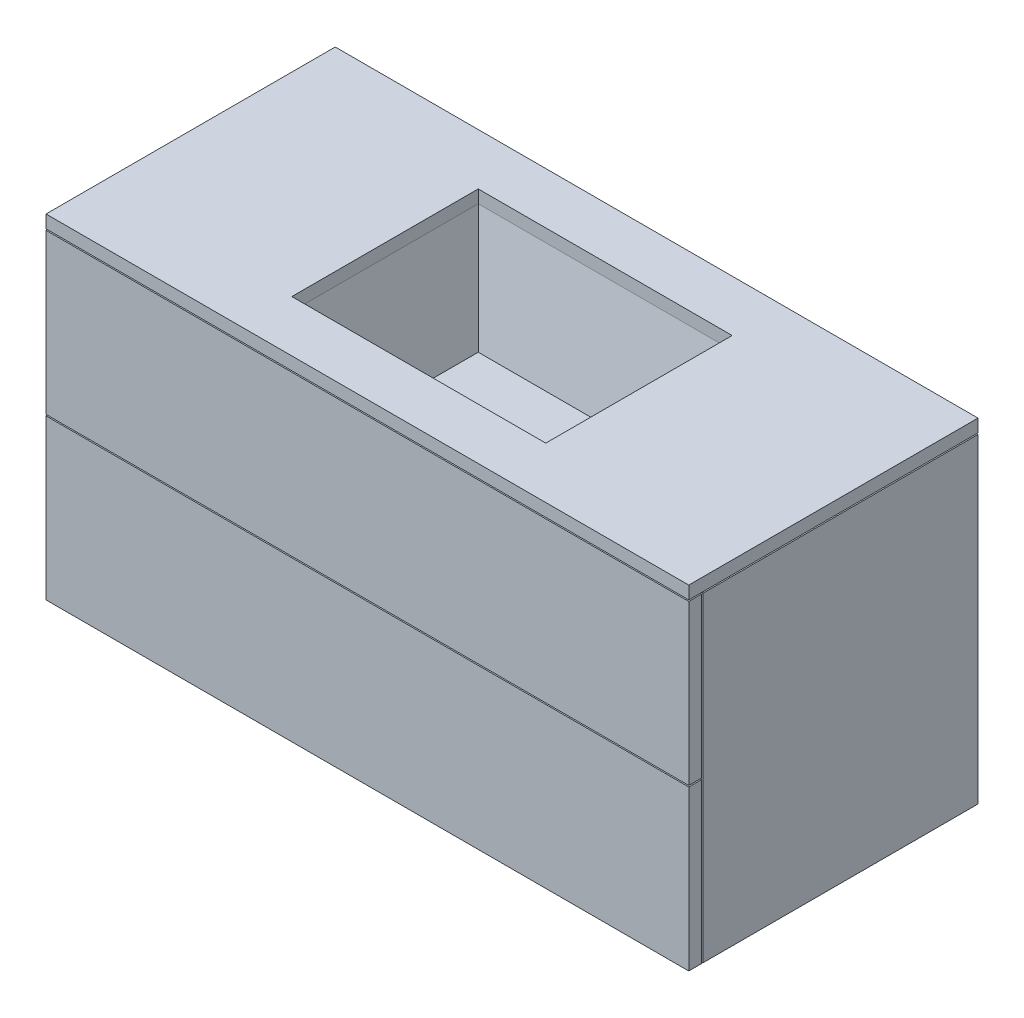
ISO-10303-21;
HEADER;
FILE_DESCRIPTION(('STEP AP214'),'2;1');
FILE_NAME('part.step','',(''),(''),'','','');
FILE_SCHEMA(('AUTOMOTIVE_DESIGN { 1 0 10303 214 1 1 1 1 }'));
ENDSEC;
DATA;
#1=APPLICATION_CONTEXT('core data for automotive mechanical design processes');
#2=APPLICATION_PROTOCOL_DEFINITION('international standard','automotive_design',2000,#1);
#3=PRODUCT_CONTEXT('',#1,'mechanical');
#4=PRODUCT('Part','Part','',(#3));
#5=PRODUCT_RELATED_PRODUCT_CATEGORY('part','',(#4));
#6=PRODUCT_DEFINITION_FORMATION('','',#4);
#7=PRODUCT_DEFINITION_CONTEXT('part definition',#1,'design');
#8=PRODUCT_DEFINITION('design','',#6,#7);
#9=PRODUCT_DEFINITION_SHAPE('','',#8);
#10=(LENGTH_UNIT() NAMED_UNIT(*) SI_UNIT(.MILLI.,.METRE.));
#11=(NAMED_UNIT(*) PLANE_ANGLE_UNIT() SI_UNIT($,.RADIAN.));
#12=(NAMED_UNIT(*) SI_UNIT($,.STERADIAN.) SOLID_ANGLE_UNIT());
#13=UNCERTAINTY_MEASURE_WITH_UNIT(LENGTH_MEASURE(1.E-05),#10,'distance_accuracy_value','');
#14=(GEOMETRIC_REPRESENTATION_CONTEXT(3) GLOBAL_UNCERTAINTY_ASSIGNED_CONTEXT((#13)) GLOBAL_UNIT_ASSIGNED_CONTEXT((#10,
#11,#12)) REPRESENTATION_CONTEXT('',''));
#15=CARTESIAN_POINT('',(0.,0.,0.));
#16=DIRECTION('',(0.,0.,1.));
#17=DIRECTION('',(1.,0.,0.));
#18=AXIS2_PLACEMENT_3D('',#15,#16,#17);
#19=CARTESIAN_POINT('',(1000.,520.,0.));
#20=DIRECTION('',(-1.,0.,0.));
#21=DIRECTION('',(0.,0.,1.));
#22=AXIS2_PLACEMENT_3D('',#19,#20,#21);
#23=PLANE('',#22);
#24=DIRECTION('',(0.,0.,1.));
#25=VECTOR('',#24,1.);
#26=CARTESIAN_POINT('',(1000.,500.,-20.));
#27=LINE('',#26,#25);
#28=CARTESIAN_POINT('',(1000.,500.,-450.));
#29=VERTEX_POINT('',#28);
#30=CARTESIAN_POINT('',(1000.,500.,0.));
#31=VERTEX_POINT('',#30);
#32=EDGE_CURVE('E362',#29,#31,#27,.T.);
#33=ORIENTED_EDGE('',*,*,#32,.F.);
#34=DIRECTION('',(0.,-1.,0.));
#35=VECTOR('',#34,1.);
#36=CARTESIAN_POINT('',(1000.,520.,-450.));
#37=LINE('',#36,#35);
#38=CARTESIAN_POINT('',(1000.,520.,-450.));
#39=VERTEX_POINT('',#38);
#40=EDGE_CURVE('E602',#39,#29,#37,.T.);
#41=ORIENTED_EDGE('',*,*,#40,.F.);
#42=DIRECTION('',(0.,0.,-1.));
#43=VECTOR('',#42,1.);
#44=CARTESIAN_POINT('',(1000.,520.,0.));
#45=LINE('',#44,#43);
#46=CARTESIAN_POINT('',(1000.,520.,0.));
#47=VERTEX_POINT('',#46);
#48=EDGE_CURVE('E625',#47,#39,#45,.T.);
#49=ORIENTED_EDGE('',*,*,#48,.F.);
#50=DIRECTION('',(0.,-1.,0.));
#51=VECTOR('',#50,1.);
#52=CARTESIAN_POINT('',(1000.,520.,0.));
#53=LINE('',#52,#51);
#54=EDGE_CURVE('E597',#47,#31,#53,.T.);
#55=ORIENTED_EDGE('',*,*,#54,.T.);
#56=EDGE_LOOP('',(#33,#41,#49,#55));
#57=FACE_BOUND('',#56,.T.);
#58=ADVANCED_FACE('F45',(#57),#23,.F.);
#59=DIRECTION('',(0.,0.,1.));
#60=VECTOR('',#59,1.);
#61=CARTESIAN_POINT('',(1000.,498.,-22.));
#62=LINE('',#61,#60);
#63=CARTESIAN_POINT('',(1000.,498.,-450.));
#64=VERTEX_POINT('',#63);
#65=CARTESIAN_POINT('',(1000.,498.,-22.));
#66=VERTEX_POINT('',#65);
#67=EDGE_CURVE('E289',#64,#66,#62,.T.);
#68=ORIENTED_EDGE('',*,*,#67,.T.);
#69=DIRECTION('',(0.,-1.,0.));
#70=VECTOR('',#69,1.);
#71=CARTESIAN_POINT('',(1000.,498.,-22.));
#72=LINE('',#71,#70);
#73=CARTESIAN_POINT('',(1000.,0.,-21.9999999999999));
#74=VERTEX_POINT('',#73);
#75=EDGE_CURVE('E285',#66,#74,#72,.T.);
#76=ORIENTED_EDGE('',*,*,#75,.T.);
#77=DIRECTION('',(0.,0.,-1.));
#78=VECTOR('',#77,1.);
#79=CARTESIAN_POINT('',(1000.,0.,0.));
#80=LINE('',#79,#78);
#81=CARTESIAN_POINT('',(1000.,0.,-450.));
#82=VERTEX_POINT('',#81);
#83=EDGE_CURVE('E616',#74,#82,#80,.T.);
#84=ORIENTED_EDGE('',*,*,#83,.T.);
#85=EDGE_CURVE('E605',#64,#82,#37,.T.);
#86=ORIENTED_EDGE('',*,*,#85,.F.);
#87=EDGE_LOOP('',(#68,#76,#84,#86));
#88=FACE_BOUND('',#87,.T.);
#89=ADVANCED_FACE('F766',(#88),#23,.F.);
#90=DIRECTION('',(0.,1.,0.));
#91=VECTOR('',#90,1.);
#92=CARTESIAN_POINT('',(1000.,498.,-20.));
#93=LINE('',#92,#91);
#94=CARTESIAN_POINT('',(1000.,250.,-20.));
#95=VERTEX_POINT('',#94);
#96=CARTESIAN_POINT('',(1000.,498.,-20.));
#97=VERTEX_POINT('',#96);
#98=EDGE_CURVE('E286',#95,#97,#93,.T.);
#99=ORIENTED_EDGE('',*,*,#98,.T.);
#100=DIRECTION('',(0.,0.,1.));
#101=VECTOR('',#100,1.);
#102=CARTESIAN_POINT('',(1000.,498.,-20.));
#103=LINE('',#102,#101);
#104=CARTESIAN_POINT('',(1000.,498.,0.));
#105=VERTEX_POINT('',#104);
#106=EDGE_CURVE('E364',#97,#105,#103,.T.);
#107=ORIENTED_EDGE('',*,*,#106,.T.);
#108=CARTESIAN_POINT('',(1000.,250.,0.));
#109=VERTEX_POINT('',#108);
#110=EDGE_CURVE('E600',#105,#109,#53,.T.);
#111=ORIENTED_EDGE('',*,*,#110,.T.);
#112=DIRECTION('',(0.,0.,1.));
#113=VECTOR('',#112,1.);
#114=CARTESIAN_POINT('',(1000.,250.,-20.));
#115=LINE('',#114,#113);
#116=EDGE_CURVE('E380',#95,#109,#115,.T.);
#117=ORIENTED_EDGE('',*,*,#116,.F.);
#118=EDGE_LOOP('',(#99,#107,#111,#117));
#119=FACE_BOUND('',#118,.T.);
#120=ADVANCED_FACE('F716',(#119),#23,.F.);
#121=CARTESIAN_POINT('',(1000.,0.,-20.));
#122=VERTEX_POINT('',#121);
#123=CARTESIAN_POINT('',(1000.,248.,-20.));
#124=VERTEX_POINT('',#123);
#125=EDGE_CURVE('E266',#122,#124,#93,.T.);
#126=ORIENTED_EDGE('',*,*,#125,.T.);
#127=DIRECTION('',(0.,0.,1.));
#128=VECTOR('',#127,1.);
#129=CARTESIAN_POINT('',(1000.,248.,-20.));
#130=LINE('',#129,#128);
#131=CARTESIAN_POINT('',(1000.,248.,0.));
#132=VERTEX_POINT('',#131);
#133=EDGE_CURVE('E382',#124,#132,#130,.T.);
#134=ORIENTED_EDGE('',*,*,#133,.T.);
#135=CARTESIAN_POINT('',(1000.,0.,0.));
#136=VERTEX_POINT('',#135);
#137=EDGE_CURVE('E601',#132,#136,#53,.T.);
#138=ORIENTED_EDGE('',*,*,#137,.T.);
#139=EDGE_CURVE('E614',#136,#122,#80,.T.);
#140=ORIENTED_EDGE('',*,*,#139,.T.);
#141=EDGE_LOOP('',(#126,#134,#138,#140));
#142=FACE_BOUND('',#141,.T.);
#143=ADVANCED_FACE('F740',(#142),#23,.F.);
#144=CARTESIAN_POINT('',(0.,520.,-450.));
#145=DIRECTION('',(0.,0.,1.));
#146=DIRECTION('',(1.,0.,0.));
#147=AXIS2_PLACEMENT_3D('',#144,#145,#146);
#148=PLANE('',#147);
#149=DIRECTION('',(1.,0.,0.));
#150=VECTOR('',#149,1.);
#151=CARTESIAN_POINT('',(980.,500.,-450.));
#152=LINE('',#151,#150);
#153=CARTESIAN_POINT('',(980.,500.,-450.));
#154=VERTEX_POINT('',#153);
#155=EDGE_CURVE('E292',#154,#29,#152,.T.);
#156=ORIENTED_EDGE('',*,*,#155,.F.);
#157=DIRECTION('',(0.,-1.,0.));
#158=VECTOR('',#157,1.);
#159=CARTESIAN_POINT('',(980.,500.,-450.));
#160=LINE('',#159,#158);
#161=CARTESIAN_POINT('',(980.,498.,-450.));
#162=VERTEX_POINT('',#161);
#163=EDGE_CURVE('E280',#154,#162,#160,.T.);
#164=ORIENTED_EDGE('',*,*,#163,.T.);
#165=DIRECTION('',(1.,0.,0.));
#166=VECTOR('',#165,1.);
#167=CARTESIAN_POINT('',(980.,498.,-450.));
#168=LINE('',#167,#166);
#169=EDGE_CURVE('E296',#162,#64,#168,.T.);
#170=ORIENTED_EDGE('',*,*,#169,.T.);
#171=ORIENTED_EDGE('',*,*,#85,.T.);
#172=DIRECTION('',(-1.,0.,0.));
#173=VECTOR('',#172,1.);
#174=CARTESIAN_POINT('',(0.,0.,-450.));
#175=LINE('',#174,#173);
#176=CARTESIAN_POINT('',(0.,0.,-450.));
#177=VERTEX_POINT('',#176);
#178=EDGE_CURVE('E610',#82,#177,#175,.T.);
#179=ORIENTED_EDGE('',*,*,#178,.T.);
#180=DIRECTION('',(0.,-1.,0.));
#181=VECTOR('',#180,1.);
#182=CARTESIAN_POINT('',(0.,520.,-450.));
#183=LINE('',#182,#181);
#184=CARTESIAN_POINT('',(0.,498.,-450.));
#185=VERTEX_POINT('',#184);
#186=EDGE_CURVE('E609',#185,#177,#183,.T.);
#187=ORIENTED_EDGE('',*,*,#186,.F.);
#188=DIRECTION('',(-1.,0.,0.));
#189=VECTOR('',#188,1.);
#190=CARTESIAN_POINT('',(20.,498.,-450.));
#191=LINE('',#190,#189);
#192=CARTESIAN_POINT('',(20.,498.,-450.));
#193=VERTEX_POINT('',#192);
#194=EDGE_CURVE('E339',#193,#185,#191,.T.);
#195=ORIENTED_EDGE('',*,*,#194,.F.);
#196=DIRECTION('',(0.,-1.,0.));
#197=VECTOR('',#196,1.);
#198=CARTESIAN_POINT('',(20.,500.,-450.));
#199=LINE('',#198,#197);
#200=CARTESIAN_POINT('',(20.,500.,-450.));
#201=VERTEX_POINT('',#200);
#202=EDGE_CURVE('E311',#201,#193,#199,.T.);
#203=ORIENTED_EDGE('',*,*,#202,.F.);
#204=DIRECTION('',(-1.,0.,0.));
#205=VECTOR('',#204,1.);
#206=CARTESIAN_POINT('',(20.,500.,-450.));
#207=LINE('',#206,#205);
#208=CARTESIAN_POINT('',(0.,500.,-450.));
#209=VERTEX_POINT('',#208);
#210=EDGE_CURVE('E323',#201,#209,#207,.T.);
#211=ORIENTED_EDGE('',*,*,#210,.T.);
#212=CARTESIAN_POINT('',(0.,520.,-450.));
#213=VERTEX_POINT('',#212);
#214=EDGE_CURVE('E606',#213,#209,#183,.T.);
#215=ORIENTED_EDGE('',*,*,#214,.F.);
#216=DIRECTION('',(-1.,0.,0.));
#217=VECTOR('',#216,1.);
#218=CARTESIAN_POINT('',(0.,520.,-450.));
#219=LINE('',#218,#217);
#220=EDGE_CURVE('E623',#39,#213,#219,.T.);
#221=ORIENTED_EDGE('',*,*,#220,.F.);
#222=ORIENTED_EDGE('',*,*,#40,.T.);
#223=EDGE_LOOP('',(#156,#164,#170,#171,#179,#187,#195,#203,#211,#215,#221,#222));
#224=FACE_BOUND('',#223,.T.);
#225=ADVANCED_FACE('F690',(#224),#148,.F.);
#226=CARTESIAN_POINT('',(0.,0.,0.));
#227=DIRECTION('',(0.,-1.,0.));
#228=DIRECTION('',(0.,0.,-1.));
#229=AXIS2_PLACEMENT_3D('',#226,#227,#228);
#230=PLANE('',#229);
#231=ORIENTED_EDGE('',*,*,#83,.F.);
#232=DIRECTION('',(1.,0.,0.));
#233=VECTOR('',#232,1.);
#234=CARTESIAN_POINT('',(980.,0.,-21.9999999999999));
#235=LINE('',#234,#233);
#236=CARTESIAN_POINT('',(980.,0.,-21.9999999999999));
#237=VERTEX_POINT('',#236);
#238=EDGE_CURVE('E270',#237,#74,#235,.T.);
#239=ORIENTED_EDGE('',*,*,#238,.F.);
#240=DIRECTION('',(0.,0.,1.));
#241=VECTOR('',#240,1.);
#242=CARTESIAN_POINT('',(980.,0.,-20.));
#243=LINE('',#242,#241);
#244=CARTESIAN_POINT('',(980.,0.,-20.));
#245=VERTEX_POINT('',#244);
#246=EDGE_CURVE('E253',#237,#245,#243,.T.);
#247=ORIENTED_EDGE('',*,*,#246,.T.);
#248=DIRECTION('',(1.,0.,0.));
#249=VECTOR('',#248,1.);
#250=CARTESIAN_POINT('',(980.,0.,-20.));
#251=LINE('',#250,#249);
#252=EDGE_CURVE('E263',#245,#122,#251,.T.);
#253=ORIENTED_EDGE('',*,*,#252,.T.);
#254=ORIENTED_EDGE('',*,*,#139,.F.);
#255=DIRECTION('',(1.,0.,0.));
#256=VECTOR('',#255,1.);
#257=CARTESIAN_POINT('',(0.,0.,0.));
#258=LINE('',#257,#256);
#259=CARTESIAN_POINT('',(0.,0.,0.));
#260=VERTEX_POINT('',#259);
#261=EDGE_CURVE('E617',#260,#136,#258,.T.);
#262=ORIENTED_EDGE('',*,*,#261,.F.);
#263=DIRECTION('',(0.,0.,1.));
#264=VECTOR('',#263,1.);
#265=CARTESIAN_POINT('',(0.,0.,0.));
#266=LINE('',#265,#264);
#267=CARTESIAN_POINT('',(0.,0.,-20.));
#268=VERTEX_POINT('',#267);
#269=EDGE_CURVE('E577',#268,#260,#266,.T.);
#270=ORIENTED_EDGE('',*,*,#269,.F.);
#271=DIRECTION('',(-1.,0.,0.));
#272=VECTOR('',#271,1.);
#273=CARTESIAN_POINT('',(20.,0.,-20.));
#274=LINE('',#273,#272);
#275=CARTESIAN_POINT('',(20.,0.,-20.));
#276=VERTEX_POINT('',#275);
#277=EDGE_CURVE('E331',#276,#268,#274,.T.);
#278=ORIENTED_EDGE('',*,*,#277,.F.);
#279=DIRECTION('',(0.,0.,1.));
#280=VECTOR('',#279,1.);
#281=CARTESIAN_POINT('',(20.,0.,-20.));
#282=LINE('',#281,#280);
#283=CARTESIAN_POINT('',(20.,0.,-21.9999999999999));
#284=VERTEX_POINT('',#283);
#285=EDGE_CURVE('E320',#284,#276,#282,.T.);
#286=ORIENTED_EDGE('',*,*,#285,.F.);
#287=DIRECTION('',(-1.,0.,0.));
#288=VECTOR('',#287,1.);
#289=CARTESIAN_POINT('',(20.,0.,-21.9999999999999));
#290=LINE('',#289,#288);
#291=CARTESIAN_POINT('',(0.,0.,-21.9999999999999));
#292=VERTEX_POINT('',#291);
#293=EDGE_CURVE('E334',#284,#292,#290,.T.);
#294=ORIENTED_EDGE('',*,*,#293,.T.);
#295=EDGE_CURVE('E620',#177,#292,#266,.T.);
#296=ORIENTED_EDGE('',*,*,#295,.F.);
#297=ORIENTED_EDGE('',*,*,#178,.F.);
#298=EDGE_LOOP('',(#231,#239,#247,#253,#254,#262,#270,#278,#286,#294,#296,#297));
#299=FACE_BOUND('',#298,.T.);
#300=ADVANCED_FACE('F273',(#299),#230,.T.);
#301=CARTESIAN_POINT('',(0.,520.,0.));
#302=DIRECTION('',(1.,0.,0.));
#303=DIRECTION('',(0.,0.,-1.));
#304=AXIS2_PLACEMENT_3D('',#301,#302,#303);
#305=PLANE('',#304);
#306=DIRECTION('',(0.,0.,1.));
#307=VECTOR('',#306,1.);
#308=CARTESIAN_POINT('',(0.,498.,-20.));
#309=LINE('',#308,#307);
#310=CARTESIAN_POINT('',(0.,498.,-20.));
#311=VERTEX_POINT('',#310);
#312=CARTESIAN_POINT('',(0.,498.,0.));
#313=VERTEX_POINT('',#312);
#314=EDGE_CURVE('E352',#311,#313,#309,.T.);
#315=ORIENTED_EDGE('',*,*,#314,.F.);
#316=DIRECTION('',(0.,1.,0.));
#317=VECTOR('',#316,1.);
#318=CARTESIAN_POINT('',(0.,498.,-20.));
#319=LINE('',#318,#317);
#320=CARTESIAN_POINT('',(0.,250.,-20.));
#321=VERTEX_POINT('',#320);
#322=EDGE_CURVE('E328',#321,#311,#319,.T.);
#323=ORIENTED_EDGE('',*,*,#322,.F.);
#324=DIRECTION('',(0.,0.,1.));
#325=VECTOR('',#324,1.);
#326=CARTESIAN_POINT('',(0.,250.,-20.));
#327=LINE('',#326,#325);
#328=CARTESIAN_POINT('',(0.,250.,0.));
#329=VERTEX_POINT('',#328);
#330=EDGE_CURVE('E356',#321,#329,#327,.T.);
#331=ORIENTED_EDGE('',*,*,#330,.T.);
#332=DIRECTION('',(0.,-1.,0.));
#333=VECTOR('',#332,1.);
#334=CARTESIAN_POINT('',(0.,520.,0.));
#335=LINE('',#334,#333);
#336=EDGE_CURVE('E595',#313,#329,#335,.T.);
#337=ORIENTED_EDGE('',*,*,#336,.F.);
#338=EDGE_LOOP('',(#315,#323,#331,#337));
#339=FACE_BOUND('',#338,.T.);
#340=ADVANCED_FACE('F726',(#339),#305,.F.);
#341=DIRECTION('',(0.,0.,1.));
#342=VECTOR('',#341,1.);
#343=CARTESIAN_POINT('',(0.,248.,-20.));
#344=LINE('',#343,#342);
#345=CARTESIAN_POINT('',(0.,248.,-20.));
#346=VERTEX_POINT('',#345);
#347=CARTESIAN_POINT('',(0.,248.,0.));
#348=VERTEX_POINT('',#347);
#349=EDGE_CURVE('E374',#346,#348,#344,.T.);
#350=ORIENTED_EDGE('',*,*,#349,.F.);
#351=EDGE_CURVE('E329',#268,#346,#319,.T.);
#352=ORIENTED_EDGE('',*,*,#351,.F.);
#353=ORIENTED_EDGE('',*,*,#269,.T.);
#354=EDGE_CURVE('E596',#348,#260,#335,.T.);
#355=ORIENTED_EDGE('',*,*,#354,.F.);
#356=EDGE_LOOP('',(#350,#352,#353,#355));
#357=FACE_BOUND('',#356,.T.);
#358=ADVANCED_FACE('F748',(#357),#305,.F.);
#359=ORIENTED_EDGE('',*,*,#295,.T.);
#360=DIRECTION('',(0.,-1.,0.));
#361=VECTOR('',#360,1.);
#362=CARTESIAN_POINT('',(0.,498.,-22.));
#363=LINE('',#362,#361);
#364=CARTESIAN_POINT('',(0.,498.,-22.));
#365=VERTEX_POINT('',#364);
#366=EDGE_CURVE('E326',#365,#292,#363,.T.);
#367=ORIENTED_EDGE('',*,*,#366,.F.);
#368=DIRECTION('',(0.,0.,1.));
#369=VECTOR('',#368,1.);
#370=CARTESIAN_POINT('',(0.,498.,-22.));
#371=LINE('',#370,#369);
#372=EDGE_CURVE('E303',#185,#365,#371,.T.);
#373=ORIENTED_EDGE('',*,*,#372,.F.);
#374=ORIENTED_EDGE('',*,*,#186,.T.);
#375=EDGE_LOOP('',(#359,#367,#373,#374));
#376=FACE_BOUND('',#375,.T.);
#377=ADVANCED_FACE('F760',(#376),#305,.F.);
#378=CARTESIAN_POINT('',(0.,520.,0.));
#379=DIRECTION('',(0.,0.,-1.));
#380=DIRECTION('',(-1.,0.,0.));
#381=AXIS2_PLACEMENT_3D('',#378,#379,#380);
#382=PLANE('',#381);
#383=CARTESIAN_POINT('',(0.,520.,0.));
#384=VERTEX_POINT('',#383);
#385=CARTESIAN_POINT('',(0.,500.,0.));
#386=VERTEX_POINT('',#385);
#387=EDGE_CURVE('E592',#384,#386,#335,.T.);
#388=ORIENTED_EDGE('',*,*,#387,.T.);
#389=DIRECTION('',(-1.,0.,0.));
#390=VECTOR('',#389,1.);
#391=CARTESIAN_POINT('',(0.,500.,0.));
#392=LINE('',#391,#390);
#393=EDGE_CURVE('E355',#31,#386,#392,.T.);
#394=ORIENTED_EDGE('',*,*,#393,.F.);
#395=ORIENTED_EDGE('',*,*,#54,.F.);
#396=DIRECTION('',(1.,0.,0.));
#397=VECTOR('',#396,1.);
#398=CARTESIAN_POINT('',(0.,520.,0.));
#399=LINE('',#398,#397);
#400=EDGE_CURVE('E627',#384,#47,#399,.T.);
#401=ORIENTED_EDGE('',*,*,#400,.F.);
#402=EDGE_LOOP('',(#388,#394,#395,#401));
#403=FACE_BOUND('',#402,.T.);
#404=ADVANCED_FACE('F684',(#403),#382,.F.);
#405=ORIENTED_EDGE('',*,*,#110,.F.);
#406=DIRECTION('',(1.,0.,0.));
#407=VECTOR('',#406,1.);
#408=CARTESIAN_POINT('',(0.,498.,0.));
#409=LINE('',#408,#407);
#410=EDGE_CURVE('E353',#313,#105,#409,.T.);
#411=ORIENTED_EDGE('',*,*,#410,.F.);
#412=ORIENTED_EDGE('',*,*,#336,.T.);
#413=DIRECTION('',(-1.,0.,0.));
#414=VECTOR('',#413,1.);
#415=CARTESIAN_POINT('',(0.,250.,0.));
#416=LINE('',#415,#414);
#417=EDGE_CURVE('E376',#109,#329,#416,.T.);
#418=ORIENTED_EDGE('',*,*,#417,.F.);
#419=EDGE_LOOP('',(#405,#411,#412,#418));
#420=FACE_BOUND('',#419,.T.);
#421=ADVANCED_FACE('F723',(#420),#382,.F.);
#422=ORIENTED_EDGE('',*,*,#214,.T.);
#423=DIRECTION('',(0.,0.,1.));
#424=VECTOR('',#423,1.);
#425=CARTESIAN_POINT('',(0.,500.,-20.));
#426=LINE('',#425,#424);
#427=EDGE_CURVE('E358',#209,#386,#426,.T.);
#428=ORIENTED_EDGE('',*,*,#427,.T.);
#429=ORIENTED_EDGE('',*,*,#387,.F.);
#430=DIRECTION('',(0.,0.,1.));
#431=VECTOR('',#430,1.);
#432=CARTESIAN_POINT('',(0.,520.,0.));
#433=LINE('',#432,#431);
#434=EDGE_CURVE('E613',#213,#384,#433,.T.);
#435=ORIENTED_EDGE('',*,*,#434,.F.);
#436=EDGE_LOOP('',(#422,#428,#429,#435));
#437=FACE_BOUND('',#436,.T.);
#438=ADVANCED_FACE('F47',(#437),#305,.F.);
#439=ORIENTED_EDGE('',*,*,#137,.F.);
#440=DIRECTION('',(1.,0.,0.));
#441=VECTOR('',#440,1.);
#442=CARTESIAN_POINT('',(0.,248.,0.));
#443=LINE('',#442,#441);
#444=EDGE_CURVE('E345',#348,#132,#443,.T.);
#445=ORIENTED_EDGE('',*,*,#444,.F.);
#446=ORIENTED_EDGE('',*,*,#354,.T.);
#447=ORIENTED_EDGE('',*,*,#261,.T.);
#448=EDGE_LOOP('',(#439,#445,#446,#447));
#449=FACE_BOUND('',#448,.T.);
#450=ADVANCED_FACE('F675',(#449),#382,.F.);
#451=CARTESIAN_POINT('',(0.,520.,0.));
#452=DIRECTION('',(0.,-1.,0.));
#453=DIRECTION('',(0.,0.,-1.));
#454=AXIS2_PLACEMENT_3D('',#451,#452,#453);
#455=PLANE('',#454);
#456=DIRECTION('',(1.,0.,0.));
#457=VECTOR('',#456,1.);
#458=CARTESIAN_POINT('',(302.5,520.,-80.0000000000001));
#459=LINE('',#458,#457);
#460=CARTESIAN_POINT('',(302.5,520.,-80.0000000000001));
#461=VERTEX_POINT('',#460);
#462=CARTESIAN_POINT('',(697.5,520.,-80.));
#463=VERTEX_POINT('',#462);
#464=EDGE_CURVE('E516',#461,#463,#459,.T.);
#465=ORIENTED_EDGE('',*,*,#464,.F.);
#466=DIRECTION('',(0.,0.,1.));
#467=VECTOR('',#466,1.);
#468=CARTESIAN_POINT('',(302.5,520.,-370.));
#469=LINE('',#468,#467);
#470=CARTESIAN_POINT('',(302.5,520.,-370.));
#471=VERTEX_POINT('',#470);
#472=EDGE_CURVE('E484',#471,#461,#469,.T.);
#473=ORIENTED_EDGE('',*,*,#472,.F.);
#474=DIRECTION('',(-1.,0.,0.));
#475=VECTOR('',#474,1.);
#476=CARTESIAN_POINT('',(302.5,520.,-370.));
#477=LINE('',#476,#475);
#478=CARTESIAN_POINT('',(697.5,520.,-370.));
#479=VERTEX_POINT('',#478);
#480=EDGE_CURVE('E631',#479,#471,#477,.T.);
#481=ORIENTED_EDGE('',*,*,#480,.F.);
#482=DIRECTION('',(0.,0.,-1.));
#483=VECTOR('',#482,1.);
#484=CARTESIAN_POINT('',(697.5,520.,-370.));
#485=LINE('',#484,#483);
#486=EDGE_CURVE('E634',#463,#479,#485,.T.);
#487=ORIENTED_EDGE('',*,*,#486,.F.);
#488=EDGE_LOOP('',(#465,#473,#481,#487));
#489=FACE_BOUND('',#488,.T.);
#490=ORIENTED_EDGE('',*,*,#434,.T.);
#491=ORIENTED_EDGE('',*,*,#400,.T.);
#492=ORIENTED_EDGE('',*,*,#48,.T.);
#493=ORIENTED_EDGE('',*,*,#220,.T.);
#494=EDGE_LOOP('',(#490,#491,#492,#493));
#495=FACE_BOUND('',#494,.T.);
#496=ADVANCED_FACE('F672',(#489,#495),#455,.F.);
#497=CARTESIAN_POINT('',(302.5,500.,-370.));
#498=DIRECTION('',(-1.,0.,0.));
#499=DIRECTION('',(0.,0.,1.));
#500=AXIS2_PLACEMENT_3D('',#497,#498,#499);
#501=PLANE('',#500);
#502=ORIENTED_EDGE('',*,*,#472,.T.);
#503=DIRECTION('',(0.,1.,0.));
#504=VECTOR('',#503,1.);
#505=CARTESIAN_POINT('',(302.5,500.,-80.0000000000001));
#506=LINE('',#505,#504);
#507=CARTESIAN_POINT('',(302.5,500.,-80.));
#508=VERTEX_POINT('',#507);
#509=EDGE_CURVE('E521',#508,#461,#506,.T.);
#510=ORIENTED_EDGE('',*,*,#509,.F.);
#511=CARTESIAN_POINT('',(302.5,500.,-370.));
#512=DIRECTION('',(0.,0.,1.));
#513=VECTOR('',#512,1.);
#514=LINE('',#511,#513);
#515=CARTESIAN_POINT('',(302.5,500.,-370.));
#516=VERTEX_POINT('',#515);
#517=EDGE_CURVE('E432',#516,#508,#514,.T.);
#518=ORIENTED_EDGE('',*,*,#517,.F.);
#519=DIRECTION('',(0.,1.,0.));
#520=VECTOR('',#519,1.);
#521=CARTESIAN_POINT('',(302.5,500.,-370.));
#522=LINE('',#521,#520);
#523=EDGE_CURVE('E575',#516,#471,#522,.T.);
#524=ORIENTED_EDGE('',*,*,#523,.T.);
#525=EDGE_LOOP('',(#502,#510,#518,#524));
#526=FACE_BOUND('',#525,.T.);
#527=ADVANCED_FACE('F548',(#526),#501,.F.);
#528=CARTESIAN_POINT('',(302.5,500.,-370.));
#529=DIRECTION('',(0.,0.,-1.));
#530=DIRECTION('',(-1.,0.,0.));
#531=AXIS2_PLACEMENT_3D('',#528,#529,#530);
#532=PLANE('',#531);
#533=ORIENTED_EDGE('',*,*,#480,.T.);
#534=ORIENTED_EDGE('',*,*,#523,.F.);
#535=CARTESIAN_POINT('',(697.5,500.,-370.));
#536=DIRECTION('',(-1.,0.,0.));
#537=VECTOR('',#536,1.);
#538=LINE('',#535,#537);
#539=CARTESIAN_POINT('',(697.5,500.,-370.));
#540=VERTEX_POINT('',#539);
#541=EDGE_CURVE('E528',#540,#516,#538,.T.);
#542=ORIENTED_EDGE('',*,*,#541,.F.);
#543=DIRECTION('',(0.,1.,0.));
#544=VECTOR('',#543,1.);
#545=CARTESIAN_POINT('',(697.5,500.,-370.));
#546=LINE('',#545,#544);
#547=EDGE_CURVE('E520',#540,#479,#546,.T.);
#548=ORIENTED_EDGE('',*,*,#547,.T.);
#549=EDGE_LOOP('',(#533,#534,#542,#548));
#550=FACE_BOUND('',#549,.T.);
#551=ADVANCED_FACE('F543',(#550),#532,.F.);
#552=CARTESIAN_POINT('',(697.5,500.,-370.));
#553=DIRECTION('',(1.,0.,0.));
#554=DIRECTION('',(0.,0.,-1.));
#555=AXIS2_PLACEMENT_3D('',#552,#553,#554);
#556=PLANE('',#555);
#557=ORIENTED_EDGE('',*,*,#486,.T.);
#558=ORIENTED_EDGE('',*,*,#547,.F.);
#559=CARTESIAN_POINT('',(697.5,500.,-80.));
#560=DIRECTION('',(0.,0.,-1.));
#561=VECTOR('',#560,1.);
#562=LINE('',#559,#561);
#563=CARTESIAN_POINT('',(697.5,500.,-80.));
#564=VERTEX_POINT('',#563);
#565=EDGE_CURVE('E510',#564,#540,#562,.T.);
#566=ORIENTED_EDGE('',*,*,#565,.F.);
#567=DIRECTION('',(0.,1.,0.));
#568=VECTOR('',#567,1.);
#569=CARTESIAN_POINT('',(697.5,500.,-80.));
#570=LINE('',#569,#568);
#571=EDGE_CURVE('E512',#564,#463,#570,.T.);
#572=ORIENTED_EDGE('',*,*,#571,.T.);
#573=EDGE_LOOP('',(#557,#558,#566,#572));
#574=FACE_BOUND('',#573,.T.);
#575=ADVANCED_FACE('F525',(#574),#556,.F.);
#576=CARTESIAN_POINT('',(302.5,500.,-80.0000000000001));
#577=DIRECTION('',(0.,0.,1.));
#578=DIRECTION('',(1.,0.,0.));
#579=AXIS2_PLACEMENT_3D('',#576,#577,#578);
#580=PLANE('',#579);
#581=ORIENTED_EDGE('',*,*,#464,.T.);
#582=ORIENTED_EDGE('',*,*,#571,.F.);
#583=CARTESIAN_POINT('',(302.5,500.,-80.));
#584=DIRECTION('',(1.,0.,0.));
#585=VECTOR('',#584,1.);
#586=LINE('',#583,#585);
#587=EDGE_CURVE('E505',#508,#564,#586,.T.);
#588=ORIENTED_EDGE('',*,*,#587,.F.);
#589=ORIENTED_EDGE('',*,*,#509,.T.);
#590=EDGE_LOOP('',(#581,#582,#588,#589));
#591=FACE_BOUND('',#590,.T.);
#592=ADVANCED_FACE('F514',(#591),#580,.F.);
#593=CARTESIAN_POINT('',(0.,330.,0.));
#594=DIRECTION('',(0.,1.,0.));
#595=DIRECTION('',(0.,0.,1.));
#596=AXIS2_PLACEMENT_3D('',#593,#594,#595);
#597=PLANE('',#596);
#598=DIRECTION('',(0.,0.,1.));
#599=VECTOR('',#598,1.);
#600=CARTESIAN_POINT('',(332.5,330.,-340.));
#601=LINE('',#600,#599);
#602=CARTESIAN_POINT('',(332.5,330.,-340.));
#603=VERTEX_POINT('',#602);
#604=CARTESIAN_POINT('',(332.5,330.,-110.));
#605=VERTEX_POINT('',#604);
#606=EDGE_CURVE('E361',#603,#605,#601,.T.);
#607=ORIENTED_EDGE('',*,*,#606,.T.);
#608=DIRECTION('',(1.,0.,0.));
#609=VECTOR('',#608,1.);
#610=CARTESIAN_POINT('',(332.5,330.,-110.));
#611=LINE('',#610,#609);
#612=CARTESIAN_POINT('',(667.5,330.,-110.));
#613=VERTEX_POINT('',#612);
#614=EDGE_CURVE('E473',#605,#613,#611,.T.);
#615=ORIENTED_EDGE('',*,*,#614,.T.);
#616=DIRECTION('',(0.,0.,-1.));
#617=VECTOR('',#616,1.);
#618=CARTESIAN_POINT('',(667.5,330.,-340.));
#619=LINE('',#618,#617);
#620=CARTESIAN_POINT('',(667.5,330.,-340.));
#621=VERTEX_POINT('',#620);
#622=EDGE_CURVE('E489',#613,#621,#619,.T.);
#623=ORIENTED_EDGE('',*,*,#622,.T.);
#624=DIRECTION('',(-1.,0.,0.));
#625=VECTOR('',#624,1.);
#626=CARTESIAN_POINT('',(332.5,330.,-340.));
#627=LINE('',#626,#625);
#628=EDGE_CURVE('E390',#621,#603,#627,.T.);
#629=ORIENTED_EDGE('',*,*,#628,.T.);
#630=EDGE_LOOP('',(#607,#615,#623,#629));
#631=FACE_BOUND('',#630,.T.);
#632=ADVANCED_FACE('F409',(#631),#597,.T.);
#633=CARTESIAN_POINT('',(0.,-48.2214765100671,-273.255033557047));
#634=DIRECTION('',(0.,0.173785333909047,0.984783558817937));
#635=DIRECTION('',(0.,-0.984783558817937,0.173785333909047));
#636=AXIS2_PLACEMENT_3D('',#633,#634,#635);
#637=PLANE('',#636);
#638=DIRECTION('',(-0.171219043660604,0.970241247410094,-0.171219043660605));
#639=VECTOR('',#638,1.);
#640=CARTESIAN_POINT('',(332.5,330.,-340.));
#641=LINE('',#640,#639);
#642=EDGE_CURVE('E660',#603,#516,#641,.T.);
#643=ORIENTED_EDGE('',*,*,#642,.F.);
#644=ORIENTED_EDGE('',*,*,#628,.F.);
#645=DIRECTION('',(0.171219043660604,0.970241247410095,-0.171219043660605));
#646=VECTOR('',#645,1.);
#647=CARTESIAN_POINT('',(667.5,330.,-340.));
#648=LINE('',#647,#646);
#649=EDGE_CURVE('E396',#621,#540,#648,.T.);
#650=ORIENTED_EDGE('',*,*,#649,.T.);
#651=ORIENTED_EDGE('',*,*,#541,.T.);
#652=EDGE_LOOP('',(#643,#644,#650,#651));
#653=FACE_BOUND('',#652,.T.);
#654=ADVANCED_FACE('F398',(#653),#637,.T.);
#655=CARTESIAN_POINT('',(590.864093959733,-104.270134228187,0.));
#656=DIRECTION('',(-0.984783558817937,0.173785333909047,0.));
#657=DIRECTION('',(-0.173785333909047,-0.984783558817937,0.));
#658=AXIS2_PLACEMENT_3D('',#655,#656,#657);
#659=PLANE('',#658);
#660=ORIENTED_EDGE('',*,*,#649,.F.);
#661=ORIENTED_EDGE('',*,*,#622,.F.);
#662=DIRECTION('',(0.171219043660604,0.970241247410094,0.171219043660606));
#663=VECTOR('',#662,1.);
#664=CARTESIAN_POINT('',(667.5,330.,-110.));
#665=LINE('',#664,#663);
#666=EDGE_CURVE('E466',#613,#564,#665,.T.);
#667=ORIENTED_EDGE('',*,*,#666,.T.);
#668=ORIENTED_EDGE('',*,*,#565,.T.);
#669=EDGE_LOOP('',(#660,#661,#667,#668));
#670=FACE_BOUND('',#669,.T.);
#671=ADVANCED_FACE('F408',(#670),#659,.T.);
#672=CARTESIAN_POINT('',(378.934563758389,66.8708053691273,0.));
#673=DIRECTION('',(0.984783558817937,0.173785333909047,0.));
#674=DIRECTION('',(-0.173785333909047,0.984783558817937,0.));
#675=AXIS2_PLACEMENT_3D('',#672,#673,#674);
#676=PLANE('',#675);
#677=DIRECTION('',(-0.171219043660604,0.970241247410094,0.171219043660605));
#678=VECTOR('',#677,1.);
#679=CARTESIAN_POINT('',(332.5,330.,-110.));
#680=LINE('',#679,#678);
#681=EDGE_CURVE('E459',#605,#508,#680,.T.);
#682=ORIENTED_EDGE('',*,*,#681,.F.);
#683=ORIENTED_EDGE('',*,*,#606,.F.);
#684=ORIENTED_EDGE('',*,*,#642,.T.);
#685=ORIENTED_EDGE('',*,*,#517,.T.);
#686=EDGE_LOOP('',(#682,#683,#684,#685));
#687=FACE_BOUND('',#686,.T.);
#688=ADVANCED_FACE('F439',(#687),#676,.T.);
#689=CARTESIAN_POINT('',(0.,28.791946308725,-163.154362416108));
#690=DIRECTION('',(0.,0.173785333909048,-0.984783558817937));
#691=DIRECTION('',(0.,0.984783558817937,0.173785333909048));
#692=AXIS2_PLACEMENT_3D('',#689,#690,#691);
#693=PLANE('',#692);
#694=ORIENTED_EDGE('',*,*,#666,.F.);
#695=ORIENTED_EDGE('',*,*,#614,.F.);
#696=ORIENTED_EDGE('',*,*,#681,.T.);
#697=ORIENTED_EDGE('',*,*,#587,.T.);
#698=EDGE_LOOP('',(#694,#695,#696,#697));
#699=FACE_BOUND('',#698,.T.);
#700=ADVANCED_FACE('F448',(#699),#693,.T.);
#701=CARTESIAN_POINT('',(0.,250.,-20.));
#702=DIRECTION('',(0.,1.,0.));
#703=DIRECTION('',(0.,0.,1.));
#704=AXIS2_PLACEMENT_3D('',#701,#702,#703);
#705=PLANE('',#704);
#706=ORIENTED_EDGE('',*,*,#417,.T.);
#707=ORIENTED_EDGE('',*,*,#330,.F.);
#708=DIRECTION('',(1.,0.,0.));
#709=VECTOR('',#708,1.);
#710=CARTESIAN_POINT('',(0.,250.,-20.));
#711=LINE('',#710,#709);
#712=CARTESIAN_POINT('',(20.,250.,-20.));
#713=VERTEX_POINT('',#712);
#714=EDGE_CURVE('E333',#321,#713,#711,.T.);
#715=ORIENTED_EDGE('',*,*,#714,.T.);
#716=DIRECTION('',(-1.,0.,0.));
#717=VECTOR('',#716,1.);
#718=CARTESIAN_POINT('',(0.,250.,-20.));
#719=LINE('',#718,#717);
#720=CARTESIAN_POINT('',(980.,250.,-20.));
#721=VERTEX_POINT('',#720);
#722=EDGE_CURVE('E370',#721,#713,#719,.T.);
#723=ORIENTED_EDGE('',*,*,#722,.F.);
#724=EDGE_CURVE('E372',#95,#721,#719,.T.);
#725=ORIENTED_EDGE('',*,*,#724,.F.);
#726=ORIENTED_EDGE('',*,*,#116,.T.);
#727=EDGE_LOOP('',(#706,#707,#715,#723,#725,#726));
#728=FACE_BOUND('',#727,.T.);
#729=ADVANCED_FACE('F836',(#728),#705,.F.);
#730=CARTESIAN_POINT('',(0.,248.,-20.));
#731=DIRECTION('',(0.,-1.,0.));
#732=DIRECTION('',(0.,0.,-1.));
#733=AXIS2_PLACEMENT_3D('',#730,#731,#732);
#734=PLANE('',#733);
#735=ORIENTED_EDGE('',*,*,#444,.T.);
#736=ORIENTED_EDGE('',*,*,#133,.F.);
#737=DIRECTION('',(1.,0.,0.));
#738=VECTOR('',#737,1.);
#739=CARTESIAN_POINT('',(0.,248.,-20.));
#740=LINE('',#739,#738);
#741=CARTESIAN_POINT('',(980.,248.,-20.));
#742=VERTEX_POINT('',#741);
#743=EDGE_CURVE('E295',#742,#124,#740,.T.);
#744=ORIENTED_EDGE('',*,*,#743,.F.);
#745=DIRECTION('',(1.,0.,0.));
#746=VECTOR('',#745,1.);
#747=CARTESIAN_POINT('',(0.,248.,-20.));
#748=LINE('',#747,#746);
#749=CARTESIAN_POINT('',(20.,248.,-20.));
#750=VERTEX_POINT('',#749);
#751=EDGE_CURVE('E371',#750,#742,#748,.T.);
#752=ORIENTED_EDGE('',*,*,#751,.F.);
#753=EDGE_CURVE('E368',#346,#750,#748,.T.);
#754=ORIENTED_EDGE('',*,*,#753,.F.);
#755=ORIENTED_EDGE('',*,*,#349,.T.);
#756=EDGE_LOOP('',(#735,#736,#744,#752,#754,#755));
#757=FACE_BOUND('',#756,.T.);
#758=ADVANCED_FACE('F743',(#757),#734,.F.);
#759=CARTESIAN_POINT('',(0.,0.,-20.));
#760=DIRECTION('',(0.,0.,1.));
#761=DIRECTION('',(1.,0.,0.));
#762=AXIS2_PLACEMENT_3D('',#759,#760,#761);
#763=PLANE('',#762);
#764=DIRECTION('',(0.,1.,0.));
#765=VECTOR('',#764,1.);
#766=CARTESIAN_POINT('',(980.,500.,-20.));
#767=LINE('',#766,#765);
#768=EDGE_CURVE('E257',#742,#721,#767,.T.);
#769=ORIENTED_EDGE('',*,*,#768,.T.);
#770=ORIENTED_EDGE('',*,*,#722,.T.);
#771=DIRECTION('',(0.,1.,0.));
#772=VECTOR('',#771,1.);
#773=CARTESIAN_POINT('',(20.,500.,-20.));
#774=LINE('',#773,#772);
#775=EDGE_CURVE('E308',#750,#713,#774,.T.);
#776=ORIENTED_EDGE('',*,*,#775,.F.);
#777=ORIENTED_EDGE('',*,*,#751,.T.);
#778=EDGE_LOOP('',(#769,#770,#776,#777));
#779=FACE_BOUND('',#778,.T.);
#780=ADVANCED_FACE('F852',(#779),#763,.T.);
#781=CARTESIAN_POINT('',(0.,500.,-20.));
#782=DIRECTION('',(0.,1.,0.));
#783=DIRECTION('',(0.,0.,1.));
#784=AXIS2_PLACEMENT_3D('',#781,#782,#783);
#785=PLANE('',#784);
#786=ORIENTED_EDGE('',*,*,#393,.T.);
#787=ORIENTED_EDGE('',*,*,#427,.F.);
#788=ORIENTED_EDGE('',*,*,#210,.F.);
#789=DIRECTION('',(0.,0.,-1.));
#790=VECTOR('',#789,1.);
#791=CARTESIAN_POINT('',(20.,500.,-20.));
#792=LINE('',#791,#790);
#793=CARTESIAN_POINT('',(20.,500.,-20.));
#794=VERTEX_POINT('',#793);
#795=EDGE_CURVE('E307',#794,#201,#792,.T.);
#796=ORIENTED_EDGE('',*,*,#795,.F.);
#797=DIRECTION('',(-1.,0.,0.));
#798=VECTOR('',#797,1.);
#799=CARTESIAN_POINT('',(0.,500.,-20.));
#800=LINE('',#799,#798);
#801=CARTESIAN_POINT('',(980.,500.,-20.));
#802=VERTEX_POINT('',#801);
#803=EDGE_CURVE('E348',#802,#794,#800,.T.);
#804=ORIENTED_EDGE('',*,*,#803,.F.);
#805=DIRECTION('',(0.,0.,-1.));
#806=VECTOR('',#805,1.);
#807=CARTESIAN_POINT('',(980.,500.,-20.));
#808=LINE('',#807,#806);
#809=EDGE_CURVE('E60',#802,#154,#808,.T.);
#810=ORIENTED_EDGE('',*,*,#809,.T.);
#811=ORIENTED_EDGE('',*,*,#155,.T.);
#812=ORIENTED_EDGE('',*,*,#32,.T.);
#813=EDGE_LOOP('',(#786,#787,#788,#796,#804,#810,#811,#812));
#814=FACE_BOUND('',#813,.T.);
#815=ADVANCED_FACE('F695',(#814),#785,.F.);
#816=CARTESIAN_POINT('',(0.,498.,-20.));
#817=DIRECTION('',(0.,-1.,0.));
#818=DIRECTION('',(0.,0.,-1.));
#819=AXIS2_PLACEMENT_3D('',#816,#817,#818);
#820=PLANE('',#819);
#821=ORIENTED_EDGE('',*,*,#410,.T.);
#822=ORIENTED_EDGE('',*,*,#106,.F.);
#823=DIRECTION('',(1.,0.,0.));
#824=VECTOR('',#823,1.);
#825=CARTESIAN_POINT('',(0.,498.,-20.));
#826=LINE('',#825,#824);
#827=CARTESIAN_POINT('',(980.,498.,-20.));
#828=VERTEX_POINT('',#827);
#829=EDGE_CURVE('E350',#828,#97,#826,.T.);
#830=ORIENTED_EDGE('',*,*,#829,.F.);
#831=CARTESIAN_POINT('',(20.,498.,-20.));
#832=VERTEX_POINT('',#831);
#833=EDGE_CURVE('E349',#832,#828,#826,.T.);
#834=ORIENTED_EDGE('',*,*,#833,.F.);
#835=EDGE_CURVE('E346',#311,#832,#826,.T.);
#836=ORIENTED_EDGE('',*,*,#835,.F.);
#837=ORIENTED_EDGE('',*,*,#314,.T.);
#838=EDGE_LOOP('',(#821,#822,#830,#834,#836,#837));
#839=FACE_BOUND('',#838,.T.);
#840=ADVANCED_FACE('F706',(#839),#820,.F.);
#841=CARTESIAN_POINT('',(0.,0.,-20.));
#842=DIRECTION('',(0.,0.,-1.));
#843=DIRECTION('',(-1.,0.,0.));
#844=AXIS2_PLACEMENT_3D('',#841,#842,#843);
#845=PLANE('',#844);
#846=ORIENTED_EDGE('',*,*,#833,.T.);
#847=DIRECTION('',(0.,1.,0.));
#848=VECTOR('',#847,1.);
#849=CARTESIAN_POINT('',(980.,0.,-20.));
#850=LINE('',#849,#848);
#851=EDGE_CURVE('E12',#828,#802,#850,.T.);
#852=ORIENTED_EDGE('',*,*,#851,.T.);
#853=ORIENTED_EDGE('',*,*,#803,.T.);
#854=DIRECTION('',(0.,-1.,0.));
#855=VECTOR('',#854,1.);
#856=CARTESIAN_POINT('',(20.,0.,-20.));
#857=LINE('',#856,#855);
#858=EDGE_CURVE('E53',#794,#832,#857,.T.);
#859=ORIENTED_EDGE('',*,*,#858,.T.);
#860=EDGE_LOOP('',(#846,#852,#853,#859));
#861=FACE_BOUND('',#860,.T.);
#862=ADVANCED_FACE('F702',(#861),#845,.F.);
#863=CARTESIAN_POINT('',(20.,498.,-20.));
#864=DIRECTION('',(0.,0.,1.));
#865=DIRECTION('',(1.,0.,0.));
#866=AXIS2_PLACEMENT_3D('',#863,#864,#865);
#867=PLANE('',#866);
#868=ORIENTED_EDGE('',*,*,#322,.T.);
#869=ORIENTED_EDGE('',*,*,#835,.T.);
#870=EDGE_CURVE('E67',#713,#832,#774,.T.);
#871=ORIENTED_EDGE('',*,*,#870,.F.);
#872=ORIENTED_EDGE('',*,*,#714,.F.);
#873=EDGE_LOOP('',(#868,#869,#871,#872));
#874=FACE_BOUND('',#873,.T.);
#875=ADVANCED_FACE('F888',(#874),#867,.F.);
#876=EDGE_CURVE('E304',#276,#750,#774,.T.);
#877=ORIENTED_EDGE('',*,*,#876,.F.);
#878=ORIENTED_EDGE('',*,*,#277,.T.);
#879=ORIENTED_EDGE('',*,*,#351,.T.);
#880=ORIENTED_EDGE('',*,*,#753,.T.);
#881=EDGE_LOOP('',(#877,#878,#879,#880));
#882=FACE_BOUND('',#881,.T.);
#883=ADVANCED_FACE('F750',(#882),#867,.F.);
#884=CARTESIAN_POINT('',(20.,498.,-22.));
#885=DIRECTION('',(0.,0.,-1.));
#886=DIRECTION('',(0.,1.,0.));
#887=AXIS2_PLACEMENT_3D('',#884,#885,#886);
#888=PLANE('',#887);
#889=ORIENTED_EDGE('',*,*,#366,.T.);
#890=ORIENTED_EDGE('',*,*,#293,.F.);
#891=DIRECTION('',(0.,-1.,0.));
#892=VECTOR('',#891,1.);
#893=CARTESIAN_POINT('',(20.,498.,-22.));
#894=LINE('',#893,#892);
#895=CARTESIAN_POINT('',(20.,498.,-22.));
#896=VERTEX_POINT('',#895);
#897=EDGE_CURVE('E317',#896,#284,#894,.T.);
#898=ORIENTED_EDGE('',*,*,#897,.F.);
#899=DIRECTION('',(-1.,0.,0.));
#900=VECTOR('',#899,1.);
#901=CARTESIAN_POINT('',(20.,498.,-22.));
#902=LINE('',#901,#900);
#903=EDGE_CURVE('E337',#896,#365,#902,.T.);
#904=ORIENTED_EDGE('',*,*,#903,.T.);
#905=EDGE_LOOP('',(#889,#890,#898,#904));
#906=FACE_BOUND('',#905,.T.);
#907=ADVANCED_FACE('F756',(#906),#888,.F.);
#908=CARTESIAN_POINT('',(20.,498.,-22.));
#909=DIRECTION('',(0.,-1.,0.));
#910=DIRECTION('',(0.,0.,-1.));
#911=AXIS2_PLACEMENT_3D('',#908,#909,#910);
#912=PLANE('',#911);
#913=ORIENTED_EDGE('',*,*,#372,.T.);
#914=ORIENTED_EDGE('',*,*,#903,.F.);
#915=DIRECTION('',(0.,0.,1.));
#916=VECTOR('',#915,1.);
#917=CARTESIAN_POINT('',(20.,498.,-22.));
#918=LINE('',#917,#916);
#919=EDGE_CURVE('E314',#193,#896,#918,.T.);
#920=ORIENTED_EDGE('',*,*,#919,.F.);
#921=ORIENTED_EDGE('',*,*,#194,.T.);
#922=EDGE_LOOP('',(#913,#914,#920,#921));
#923=FACE_BOUND('',#922,.T.);
#924=ADVANCED_FACE('F930',(#923),#912,.F.);
#925=CARTESIAN_POINT('',(20.,0.,0.));
#926=DIRECTION('',(1.,0.,0.));
#927=DIRECTION('',(0.,0.,-1.));
#928=AXIS2_PLACEMENT_3D('',#925,#926,#927);
#929=PLANE('',#928);
#930=ORIENTED_EDGE('',*,*,#876,.T.);
#931=ORIENTED_EDGE('',*,*,#775,.T.);
#932=ORIENTED_EDGE('',*,*,#870,.T.);
#933=ORIENTED_EDGE('',*,*,#858,.F.);
#934=ORIENTED_EDGE('',*,*,#795,.T.);
#935=ORIENTED_EDGE('',*,*,#202,.T.);
#936=ORIENTED_EDGE('',*,*,#919,.T.);
#937=ORIENTED_EDGE('',*,*,#897,.T.);
#938=ORIENTED_EDGE('',*,*,#285,.T.);
#939=EDGE_LOOP('',(#930,#931,#932,#933,#934,#935,#936,#937,#938));
#940=FACE_BOUND('',#939,.T.);
#941=ADVANCED_FACE('F697',(#940),#929,.F.);
#942=CARTESIAN_POINT('',(980.,498.,-20.));
#943=DIRECTION('',(0.,0.,-1.));
#944=DIRECTION('',(-1.,0.,0.));
#945=AXIS2_PLACEMENT_3D('',#942,#943,#944);
#946=PLANE('',#945);
#947=ORIENTED_EDGE('',*,*,#724,.T.);
#948=EDGE_CURVE('E261',#721,#828,#767,.T.);
#949=ORIENTED_EDGE('',*,*,#948,.T.);
#950=ORIENTED_EDGE('',*,*,#829,.T.);
#951=ORIENTED_EDGE('',*,*,#98,.F.);
#952=EDGE_LOOP('',(#947,#949,#950,#951));
#953=FACE_BOUND('',#952,.T.);
#954=ADVANCED_FACE('F712',(#953),#946,.T.);
#955=ORIENTED_EDGE('',*,*,#743,.T.);
#956=ORIENTED_EDGE('',*,*,#125,.F.);
#957=ORIENTED_EDGE('',*,*,#252,.F.);
#958=EDGE_CURVE('E248',#245,#742,#767,.T.);
#959=ORIENTED_EDGE('',*,*,#958,.T.);
#960=EDGE_LOOP('',(#955,#956,#957,#959));
#961=FACE_BOUND('',#960,.T.);
#962=ADVANCED_FACE('F264',(#961),#946,.T.);
#963=CARTESIAN_POINT('',(980.,498.,-22.));
#964=DIRECTION('',(0.,1.,0.));
#965=DIRECTION('',(0.,0.,1.));
#966=AXIS2_PLACEMENT_3D('',#963,#964,#965);
#967=PLANE('',#966);
#968=ORIENTED_EDGE('',*,*,#67,.F.);
#969=ORIENTED_EDGE('',*,*,#169,.F.);
#970=DIRECTION('',(0.,0.,1.));
#971=VECTOR('',#970,1.);
#972=CARTESIAN_POINT('',(980.,498.,-22.));
#973=LINE('',#972,#971);
#974=CARTESIAN_POINT('',(980.,498.,-22.));
#975=VERTEX_POINT('',#974);
#976=EDGE_CURVE('E276',#162,#975,#973,.T.);
#977=ORIENTED_EDGE('',*,*,#976,.T.);
#978=DIRECTION('',(1.,0.,0.));
#979=VECTOR('',#978,1.);
#980=CARTESIAN_POINT('',(980.,498.,-22.));
#981=LINE('',#980,#979);
#982=EDGE_CURVE('E299',#975,#66,#981,.T.);
#983=ORIENTED_EDGE('',*,*,#982,.T.);
#984=EDGE_LOOP('',(#968,#969,#977,#983));
#985=FACE_BOUND('',#984,.T.);
#986=ADVANCED_FACE('F773',(#985),#967,.T.);
#987=CARTESIAN_POINT('',(980.,498.,-22.));
#988=DIRECTION('',(0.,0.,1.));
#989=DIRECTION('',(0.,-1.,0.));
#990=AXIS2_PLACEMENT_3D('',#987,#988,#989);
#991=PLANE('',#990);
#992=ORIENTED_EDGE('',*,*,#75,.F.);
#993=ORIENTED_EDGE('',*,*,#982,.F.);
#994=DIRECTION('',(0.,-1.,0.));
#995=VECTOR('',#994,1.);
#996=CARTESIAN_POINT('',(980.,498.,-22.));
#997=LINE('',#996,#995);
#998=EDGE_CURVE('E274',#975,#237,#997,.T.);
#999=ORIENTED_EDGE('',*,*,#998,.T.);
#1000=ORIENTED_EDGE('',*,*,#238,.T.);
#1001=EDGE_LOOP('',(#992,#993,#999,#1000));
#1002=FACE_BOUND('',#1001,.T.);
#1003=ADVANCED_FACE('F770',(#1002),#991,.T.);
#1004=CARTESIAN_POINT('',(980.,0.,0.));
#1005=DIRECTION('',(-1.,0.,0.));
#1006=DIRECTION('',(0.,0.,-1.));
#1007=AXIS2_PLACEMENT_3D('',#1004,#1005,#1006);
#1008=PLANE('',#1007);
#1009=ORIENTED_EDGE('',*,*,#958,.F.);
#1010=ORIENTED_EDGE('',*,*,#246,.F.);
#1011=ORIENTED_EDGE('',*,*,#998,.F.);
#1012=ORIENTED_EDGE('',*,*,#976,.F.);
#1013=ORIENTED_EDGE('',*,*,#163,.F.);
#1014=ORIENTED_EDGE('',*,*,#809,.F.);
#1015=ORIENTED_EDGE('',*,*,#851,.F.);
#1016=ORIENTED_EDGE('',*,*,#948,.F.);
#1017=ORIENTED_EDGE('',*,*,#768,.F.);
#1018=EDGE_LOOP('',(#1009,#1010,#1011,#1012,#1013,#1014,#1015,#1016,#1017));
#1019=FACE_BOUND('',#1018,.T.);
#1020=ADVANCED_FACE('F250',(#1019),#1008,.F.);
#1021=CLOSED_SHELL('',(#58,#89,#120,#143,#225,#300,#340,#358,#377,#404,#421,#438,#450,#496,#527,
#551,#575,#592,#632,#654,#671,#688,#700,#729,#758,#780,#815,#840,#862,#875,#883,#907,#924,#941,
#954,#962,#986,#1003,#1020));
#1022=MANIFOLD_SOLID_BREP('B2',#1021);
#1023=ADVANCED_BREP_SHAPE_REPRESENTATION('',(#18,#1022),#14);
#1024=SHAPE_DEFINITION_REPRESENTATION(#9,#1023);
ENDSEC;
END-ISO-10303-21;
